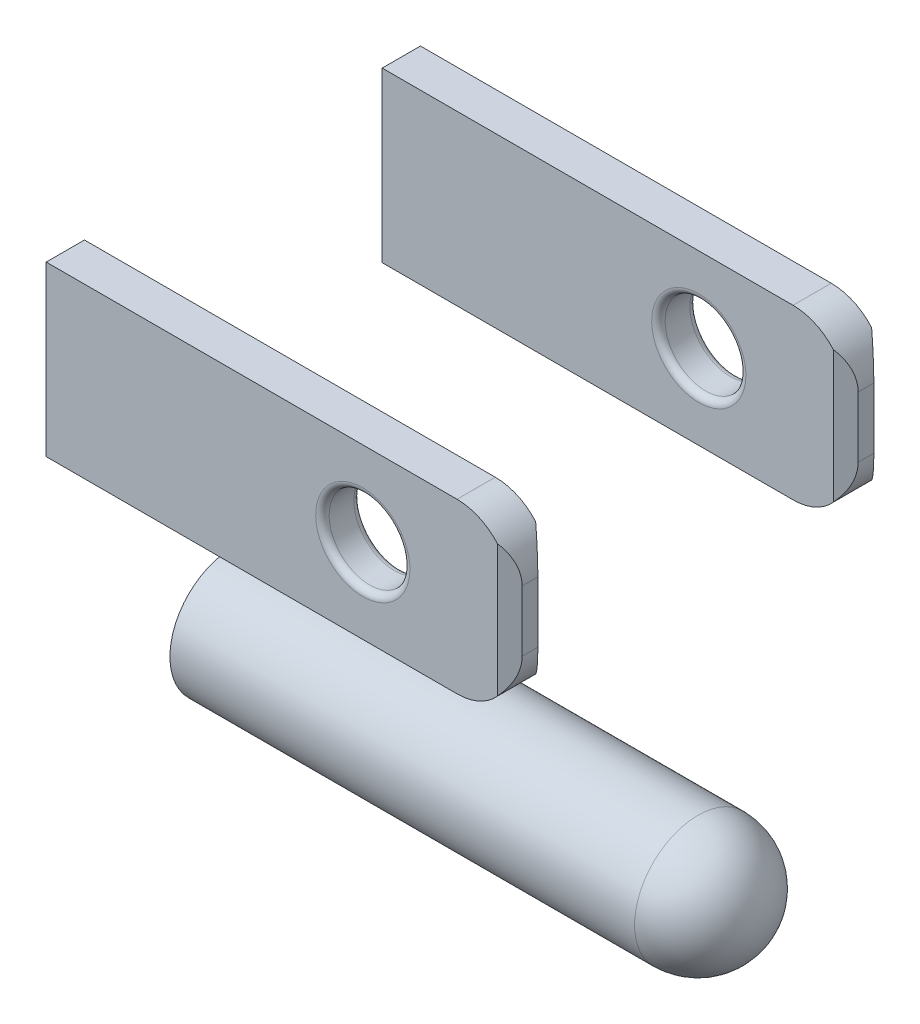
ISO-10303-21;
HEADER;
FILE_DESCRIPTION(('STEP AP214'),'2;1');
FILE_NAME('part.step','',(''),(''),'','','');
FILE_SCHEMA(('AUTOMOTIVE_DESIGN { 1 0 10303 214 1 1 1 1 }'));
ENDSEC;
DATA;
#1=APPLICATION_CONTEXT('core data for automotive mechanical design processes');
#2=APPLICATION_PROTOCOL_DEFINITION('international standard','automotive_design',2000,#1);
#3=PRODUCT_CONTEXT('',#1,'mechanical');
#4=PRODUCT('Part','Part','',(#3));
#5=PRODUCT_RELATED_PRODUCT_CATEGORY('part','',(#4));
#6=PRODUCT_DEFINITION_FORMATION('','',#4);
#7=PRODUCT_DEFINITION_CONTEXT('part definition',#1,'design');
#8=PRODUCT_DEFINITION('design','',#6,#7);
#9=PRODUCT_DEFINITION_SHAPE('','',#8);
#10=(LENGTH_UNIT() NAMED_UNIT(*) SI_UNIT(.MILLI.,.METRE.));
#11=(NAMED_UNIT(*) PLANE_ANGLE_UNIT() SI_UNIT($,.RADIAN.));
#12=(NAMED_UNIT(*) SI_UNIT($,.STERADIAN.) SOLID_ANGLE_UNIT());
#13=UNCERTAINTY_MEASURE_WITH_UNIT(LENGTH_MEASURE(1.E-05),#10,'distance_accuracy_value','');
#14=(GEOMETRIC_REPRESENTATION_CONTEXT(3) GLOBAL_UNCERTAINTY_ASSIGNED_CONTEXT((#13)) GLOBAL_UNIT_ASSIGNED_CONTEXT((#10,
#11,#12)) REPRESENTATION_CONTEXT('',''));
#15=CARTESIAN_POINT('',(0.,0.,0.));
#16=DIRECTION('',(0.,0.,1.));
#17=DIRECTION('',(1.,0.,0.));
#18=AXIS2_PLACEMENT_3D('',#15,#16,#17);
#19=CARTESIAN_POINT('',(17.26,-8.05999999999999,0.));
#20=DIRECTION('',(-1.,0.,0.));
#21=DIRECTION('',(0.,0.,1.));
#22=AXIS2_PLACEMENT_3D('',#19,#20,#21);
#23=CYLINDRICAL_SURFACE('',#22,2.355);
#24=CARTESIAN_POINT('',(17.26,-8.05999999999999,0.));
#25=DIRECTION('',(1.,0.,0.));
#26=DIRECTION('',(0.,0.,-1.));
#27=AXIS2_PLACEMENT_3D('',#24,#25,#26);
#28=CIRCLE('',#27,2.355);
#29=CARTESIAN_POINT('',(17.26,-8.05999999999999,-2.355));
#30=VERTEX_POINT('',#29);
#31=EDGE_CURVE('E11',#30,#30,#28,.T.);
#32=ORIENTED_EDGE('',*,*,#31,.F.);
#33=EDGE_LOOP('',(#32));
#34=FACE_BOUND('',#33,.T.);
#35=CARTESIAN_POINT('',(0.,-8.05999999999999,0.));
#36=DIRECTION('',(1.,0.,0.));
#37=DIRECTION('',(0.,0.,-1.));
#38=AXIS2_PLACEMENT_3D('',#35,#36,#37);
#39=CIRCLE('',#38,2.355);
#40=CARTESIAN_POINT('',(0.,-8.05999999999999,-2.355));
#41=VERTEX_POINT('',#40);
#42=EDGE_CURVE('E48',#41,#41,#39,.T.);
#43=ORIENTED_EDGE('',*,*,#42,.T.);
#44=EDGE_LOOP('',(#43));
#45=FACE_BOUND('',#44,.T.);
#46=ADVANCED_FACE('F41',(#34,#45),#23,.T.);
#47=CARTESIAN_POINT('',(17.2549946808511,-8.05999999999999,0.));
#48=DIRECTION('',(0.,0.,1.));
#49=DIRECTION('',(1.,0.,0.));
#50=AXIS2_PLACEMENT_3D('',#47,#48,#49);
#51=SPHERICAL_SURFACE('',#50,2.35500531914894);
#52=CARTESIAN_POINT('',(17.2549946808511,-8.05999999999999,0.));
#53=DIRECTION('',(1.,0.,0.));
#54=DIRECTION('',(0.,0.,-1.));
#55=AXIS2_PLACEMENT_3D('',#52,#53,#54);
#56=SPHERICAL_SURFACE('',#55,2.35500531914894);
#57=ORIENTED_EDGE('',*,*,#31,.T.);
#58=EDGE_LOOP('',(#57));
#59=FACE_BOUND('',#58,.T.);
#60=ADVANCED_FACE('F43',(#59),#56,.T.);
#61=CARTESIAN_POINT('',(0.,-8.05999999999999,0.));
#62=DIRECTION('',(1.,0.,0.));
#63=DIRECTION('',(0.,0.,-1.));
#64=AXIS2_PLACEMENT_3D('',#61,#62,#63);
#65=PLANE('',#64);
#66=ORIENTED_EDGE('',*,*,#42,.F.);
#67=EDGE_LOOP('',(#66));
#68=FACE_BOUND('',#67,.T.);
#69=ADVANCED_FACE('F55',(#68),#65,.F.);
#70=CLOSED_SHELL('',(#46,#60,#69));
#71=MANIFOLD_SOLID_BREP('B2',#70);
#72=CARTESIAN_POINT('',(17.26,0.675000000000007,5.53));
#73=DIRECTION('',(0.,0.,1.));
#74=DIRECTION('',(0.,-1.,0.));
#75=AXIS2_PLACEMENT_3D('',#72,#73,#74);
#76=PLANE('',#75);
#77=CARTESIAN_POINT('',(11.76,3.80500000000001,5.53));
#78=DIRECTION('',(0.,0.,1.));
#79=DIRECTION('',(0.,-1.,0.));
#80=AXIS2_PLACEMENT_3D('',#77,#78,#79);
#81=CIRCLE('',#80,1.75);
#82=CARTESIAN_POINT('',(11.76,2.05500000000001,5.53));
#83=VERTEX_POINT('',#82);
#84=EDGE_CURVE('E39',#83,#83,#81,.T.);
#85=ORIENTED_EDGE('',*,*,#84,.T.);
#86=EDGE_LOOP('',(#85));
#87=FACE_BOUND('',#86,.T.);
#88=DIRECTION('',(-1.,0.,0.));
#89=VECTOR('',#88,1.);
#90=CARTESIAN_POINT('',(17.26,6.93500000000001,5.53));
#91=LINE('',#90,#89);
#92=CARTESIAN_POINT('',(15.26,6.93500000000001,5.53));
#93=VERTEX_POINT('',#92);
#94=CARTESIAN_POINT('',(0.,6.93500000000001,5.53));
#95=VERTEX_POINT('',#94);
#96=EDGE_CURVE('E156',#93,#95,#91,.T.);
#97=ORIENTED_EDGE('',*,*,#96,.F.);
#98=CARTESIAN_POINT('',(15.26,4.93500000000001,5.53));
#99=DIRECTION('',(0.,0.,1.));
#100=DIRECTION('',(0.,-1.,0.));
#101=AXIS2_PLACEMENT_3D('',#98,#99,#100);
#102=CIRCLE('',#101,2.);
#103=CARTESIAN_POINT('',(16.76,6.2578756555323,5.53));
#104=VERTEX_POINT('',#103);
#105=EDGE_CURVE('E214',#93,#104,#102,.F.);
#106=ORIENTED_EDGE('',*,*,#105,.T.);
#107=DIRECTION('',(0.,-1.,0.));
#108=VECTOR('',#107,1.);
#109=CARTESIAN_POINT('',(16.76,0.675000000000007,5.53));
#110=LINE('',#109,#108);
#111=CARTESIAN_POINT('',(16.76,1.35212434446771,5.53));
#112=VERTEX_POINT('',#111);
#113=EDGE_CURVE('E196',#104,#112,#110,.T.);
#114=ORIENTED_EDGE('',*,*,#113,.T.);
#115=CARTESIAN_POINT('',(15.26,2.67500000000001,5.53));
#116=DIRECTION('',(0.,0.,1.));
#117=DIRECTION('',(0.,-1.,0.));
#118=AXIS2_PLACEMENT_3D('',#115,#116,#117);
#119=CIRCLE('',#118,2.);
#120=CARTESIAN_POINT('',(15.26,0.675000000000007,5.53));
#121=VERTEX_POINT('',#120);
#122=EDGE_CURVE('E105',#112,#121,#119,.F.);
#123=ORIENTED_EDGE('',*,*,#122,.T.);
#124=DIRECTION('',(-1.,0.,0.));
#125=VECTOR('',#124,1.);
#126=CARTESIAN_POINT('',(17.26,0.675000000000007,5.53));
#127=LINE('',#126,#125);
#128=CARTESIAN_POINT('',(0.,0.675000000000007,5.53));
#129=VERTEX_POINT('',#128);
#130=EDGE_CURVE('E177',#121,#129,#127,.T.);
#131=ORIENTED_EDGE('',*,*,#130,.T.);
#132=DIRECTION('',(0.,1.,0.));
#133=VECTOR('',#132,1.);
#134=CARTESIAN_POINT('',(0.,0.675000000000007,5.53));
#135=LINE('',#134,#133);
#136=EDGE_CURVE('E173',#129,#95,#135,.T.);
#137=ORIENTED_EDGE('',*,*,#136,.T.);
#138=EDGE_LOOP('',(#97,#106,#114,#123,#131,#137));
#139=FACE_BOUND('',#138,.T.);
#140=ADVANCED_FACE('F90',(#87,#139),#76,.F.);
#141=CARTESIAN_POINT('',(17.26,6.93500000000001,5.53));
#142=DIRECTION('',(0.,-1.,0.));
#143=DIRECTION('',(0.,0.,-1.));
#144=AXIS2_PLACEMENT_3D('',#141,#142,#143);
#145=PLANE('',#144);
#146=DIRECTION('',(-1.,0.,0.));
#147=VECTOR('',#146,1.);
#148=CARTESIAN_POINT('',(17.26,6.93500000000001,6.95));
#149=LINE('',#148,#147);
#150=CARTESIAN_POINT('',(15.26,6.93500000000001,6.95));
#151=VERTEX_POINT('',#150);
#152=CARTESIAN_POINT('',(0.,6.93500000000001,6.95));
#153=VERTEX_POINT('',#152);
#154=EDGE_CURVE('E167',#151,#153,#149,.T.);
#155=ORIENTED_EDGE('',*,*,#154,.F.);
#156=DIRECTION('',(0.,0.,1.));
#157=VECTOR('',#156,1.);
#158=CARTESIAN_POINT('',(15.26,6.93500000000001,5.94954981558864));
#159=LINE('',#158,#157);
#160=EDGE_CURVE('E163',#151,#93,#159,.F.);
#161=ORIENTED_EDGE('',*,*,#160,.T.);
#162=ORIENTED_EDGE('',*,*,#96,.T.);
#163=DIRECTION('',(0.,0.,1.));
#164=VECTOR('',#163,1.);
#165=CARTESIAN_POINT('',(0.,6.93500000000001,5.53));
#166=LINE('',#165,#164);
#167=EDGE_CURVE('E160',#95,#153,#166,.T.);
#168=ORIENTED_EDGE('',*,*,#167,.T.);
#169=EDGE_LOOP('',(#155,#161,#162,#168));
#170=FACE_BOUND('',#169,.T.);
#171=ADVANCED_FACE('F159',(#170),#145,.F.);
#172=CARTESIAN_POINT('',(17.26,6.93500000000001,6.95));
#173=DIRECTION('',(0.,0.,-1.));
#174=DIRECTION('',(0.,1.,0.));
#175=AXIS2_PLACEMENT_3D('',#172,#173,#174);
#176=PLANE('',#175);
#177=CARTESIAN_POINT('',(11.76,3.80500000000001,6.95));
#178=DIRECTION('',(0.,0.,-1.));
#179=DIRECTION('',(0.,1.,0.));
#180=AXIS2_PLACEMENT_3D('',#177,#178,#179);
#181=CIRCLE('',#180,1.75);
#182=CARTESIAN_POINT('',(11.76,5.55500000000001,6.95));
#183=VERTEX_POINT('',#182);
#184=EDGE_CURVE('E98',#183,#183,#181,.T.);
#185=ORIENTED_EDGE('',*,*,#184,.T.);
#186=EDGE_LOOP('',(#185));
#187=FACE_BOUND('',#186,.T.);
#188=DIRECTION('',(0.,1.,0.));
#189=VECTOR('',#188,1.);
#190=CARTESIAN_POINT('',(16.76,6.93500000000001,6.95));
#191=LINE('',#190,#189);
#192=CARTESIAN_POINT('',(16.76,1.35212434446771,6.95));
#193=VERTEX_POINT('',#192);
#194=CARTESIAN_POINT('',(16.76,6.2578756555323,6.95));
#195=VERTEX_POINT('',#194);
#196=EDGE_CURVE('E193',#193,#195,#191,.T.);
#197=ORIENTED_EDGE('',*,*,#196,.T.);
#198=CARTESIAN_POINT('',(15.26,4.93500000000001,6.95));
#199=DIRECTION('',(0.,0.,-1.));
#200=DIRECTION('',(0.,1.,0.));
#201=AXIS2_PLACEMENT_3D('',#198,#199,#200);
#202=CIRCLE('',#201,2.);
#203=EDGE_CURVE('E210',#195,#151,#202,.F.);
#204=ORIENTED_EDGE('',*,*,#203,.T.);
#205=ORIENTED_EDGE('',*,*,#154,.T.);
#206=DIRECTION('',(0.,-1.,0.));
#207=VECTOR('',#206,1.);
#208=CARTESIAN_POINT('',(0.,6.93500000000001,6.95));
#209=LINE('',#208,#207);
#210=CARTESIAN_POINT('',(0.,0.675000000000007,6.95));
#211=VERTEX_POINT('',#210);
#212=EDGE_CURVE('E175',#153,#211,#209,.T.);
#213=ORIENTED_EDGE('',*,*,#212,.T.);
#214=DIRECTION('',(-1.,0.,0.));
#215=VECTOR('',#214,1.);
#216=CARTESIAN_POINT('',(17.26,0.675000000000007,6.95));
#217=LINE('',#216,#215);
#218=CARTESIAN_POINT('',(15.26,0.675000000000007,6.95));
#219=VERTEX_POINT('',#218);
#220=EDGE_CURVE('E185',#219,#211,#217,.T.);
#221=ORIENTED_EDGE('',*,*,#220,.F.);
#222=CARTESIAN_POINT('',(15.26,2.67500000000001,6.95));
#223=DIRECTION('',(0.,0.,-1.));
#224=DIRECTION('',(0.,1.,0.));
#225=AXIS2_PLACEMENT_3D('',#222,#223,#224);
#226=CIRCLE('',#225,2.);
#227=EDGE_CURVE('E208',#219,#193,#226,.F.);
#228=ORIENTED_EDGE('',*,*,#227,.T.);
#229=EDGE_LOOP('',(#197,#204,#205,#213,#221,#228));
#230=FACE_BOUND('',#229,.T.);
#231=ADVANCED_FACE('F229',(#187,#230),#176,.F.);
#232=CARTESIAN_POINT('',(17.26,0.675000000000007,6.95));
#233=DIRECTION('',(0.,1.,0.));
#234=DIRECTION('',(0.,0.,1.));
#235=AXIS2_PLACEMENT_3D('',#232,#233,#234);
#236=PLANE('',#235);
#237=ORIENTED_EDGE('',*,*,#130,.F.);
#238=DIRECTION('',(0.,0.,-1.));
#239=VECTOR('',#238,1.);
#240=CARTESIAN_POINT('',(15.26,0.675000000000007,6.53045018441136));
#241=LINE('',#240,#239);
#242=EDGE_CURVE('E219',#121,#219,#241,.F.);
#243=ORIENTED_EDGE('',*,*,#242,.T.);
#244=ORIENTED_EDGE('',*,*,#220,.T.);
#245=DIRECTION('',(0.,0.,-1.));
#246=VECTOR('',#245,1.);
#247=CARTESIAN_POINT('',(0.,0.675000000000007,6.95));
#248=LINE('',#247,#246);
#249=EDGE_CURVE('E182',#211,#129,#248,.T.);
#250=ORIENTED_EDGE('',*,*,#249,.T.);
#251=EDGE_LOOP('',(#237,#243,#244,#250));
#252=FACE_BOUND('',#251,.T.);
#253=ADVANCED_FACE('F284',(#252),#236,.F.);
#254=CARTESIAN_POINT('',(17.26,0.,0.));
#255=DIRECTION('',(1.,0.,0.));
#256=DIRECTION('',(0.,0.,-1.));
#257=AXIS2_PLACEMENT_3D('',#254,#255,#256);
#258=PLANE('',#257);
#259=DIRECTION('',(0.,1.,0.));
#260=VECTOR('',#259,1.);
#261=CARTESIAN_POINT('',(17.26,6.93500000000001,5.94954981558864));
#262=LINE('',#261,#260);
#263=CARTESIAN_POINT('',(17.26,2.67500000000001,5.94954981558864));
#264=VERTEX_POINT('',#263);
#265=CARTESIAN_POINT('',(17.26,4.93500000000001,5.94954981558864));
#266=VERTEX_POINT('',#265);
#267=EDGE_CURVE('E166',#264,#266,#262,.T.);
#268=ORIENTED_EDGE('',*,*,#267,.T.);
#269=DIRECTION('',(0.,0.,1.));
#270=VECTOR('',#269,1.);
#271=CARTESIAN_POINT('',(17.26,4.93500000000001,6.53045018441136));
#272=LINE('',#271,#270);
#273=CARTESIAN_POINT('',(17.26,4.93500000000001,6.53045018441136));
#274=VERTEX_POINT('',#273);
#275=EDGE_CURVE('E201',#266,#274,#272,.T.);
#276=ORIENTED_EDGE('',*,*,#275,.T.);
#277=DIRECTION('',(0.,-1.,0.));
#278=VECTOR('',#277,1.);
#279=CARTESIAN_POINT('',(17.26,0.675000000000007,6.53045018441136));
#280=LINE('',#279,#278);
#281=CARTESIAN_POINT('',(17.26,2.67500000000001,6.53045018441136));
#282=VERTEX_POINT('',#281);
#283=EDGE_CURVE('E190',#274,#282,#280,.T.);
#284=ORIENTED_EDGE('',*,*,#283,.T.);
#285=DIRECTION('',(0.,0.,-1.));
#286=VECTOR('',#285,1.);
#287=CARTESIAN_POINT('',(17.26,2.67500000000001,5.94954981558864));
#288=LINE('',#287,#286);
#289=EDGE_CURVE('E198',#282,#264,#288,.T.);
#290=ORIENTED_EDGE('',*,*,#289,.T.);
#291=EDGE_LOOP('',(#268,#276,#284,#290));
#292=FACE_BOUND('',#291,.T.);
#293=ADVANCED_FACE('F282',(#292),#258,.T.);
#294=CARTESIAN_POINT('',(0.,0.,0.));
#295=DIRECTION('',(1.,0.,0.));
#296=DIRECTION('',(0.,0.,-1.));
#297=AXIS2_PLACEMENT_3D('',#294,#295,#296);
#298=PLANE('',#297);
#299=ORIENTED_EDGE('',*,*,#136,.F.);
#300=ORIENTED_EDGE('',*,*,#249,.F.);
#301=ORIENTED_EDGE('',*,*,#212,.F.);
#302=ORIENTED_EDGE('',*,*,#167,.F.);
#303=EDGE_LOOP('',(#299,#300,#301,#302));
#304=FACE_BOUND('',#303,.T.);
#305=ADVANCED_FACE('F171',(#304),#298,.F.);
#306=CARTESIAN_POINT('',(17.26,0.,6.53045018441136));
#307=DIRECTION('',(0.642787609686536,0.,0.766044443118981));
#308=DIRECTION('',(0.,1.,0.));
#309=AXIS2_PLACEMENT_3D('',#306,#307,#308);
#310=PLANE('',#309);
#311=ORIENTED_EDGE('',*,*,#283,.F.);
#312=CARTESIAN_POINT('',(15.26,4.93500000000001,8.20864944676591));
#313=DIRECTION('',(0.642787609686536,0.,0.766044443118981));
#314=DIRECTION('',(0.766044443118981,0.,-0.642787609686536));
#315=AXIS2_PLACEMENT_3D('',#312,#313,#314);
#316=ELLIPSE('',#315,2.61081457866455,2.);
#317=EDGE_CURVE('E206',#274,#195,#316,.T.);
#318=ORIENTED_EDGE('',*,*,#317,.T.);
#319=ORIENTED_EDGE('',*,*,#196,.F.);
#320=CARTESIAN_POINT('',(15.26,2.67500000000001,8.20864944676591));
#321=DIRECTION('',(0.642787609686536,0.,0.766044443118981));
#322=DIRECTION('',(-0.766044443118981,0.,0.642787609686536));
#323=AXIS2_PLACEMENT_3D('',#320,#321,#322);
#324=ELLIPSE('',#323,2.61081457866455,2.);
#325=EDGE_CURVE('E204',#193,#282,#324,.T.);
#326=ORIENTED_EDGE('',*,*,#325,.T.);
#327=EDGE_LOOP('',(#311,#318,#319,#326));
#328=FACE_BOUND('',#327,.T.);
#329=ADVANCED_FACE('F256',(#328),#310,.T.);
#330=CARTESIAN_POINT('',(17.26,0.,5.94954981558864));
#331=DIRECTION('',(0.642787609686536,0.,-0.766044443118981));
#332=DIRECTION('',(0.,-1.,0.));
#333=AXIS2_PLACEMENT_3D('',#330,#331,#332);
#334=PLANE('',#333);
#335=ORIENTED_EDGE('',*,*,#113,.F.);
#336=CARTESIAN_POINT('',(15.26,4.93500000000001,4.27135055323409));
#337=DIRECTION('',(0.642787609686536,0.,-0.766044443118981));
#338=DIRECTION('',(-0.766044443118981,0.,-0.642787609686536));
#339=AXIS2_PLACEMENT_3D('',#336,#337,#338);
#340=ELLIPSE('',#339,2.61081457866455,2.);
#341=EDGE_CURVE('E217',#104,#266,#340,.T.);
#342=ORIENTED_EDGE('',*,*,#341,.T.);
#343=ORIENTED_EDGE('',*,*,#267,.F.);
#344=CARTESIAN_POINT('',(15.26,2.67500000000001,4.27135055323409));
#345=DIRECTION('',(0.642787609686536,0.,-0.766044443118981));
#346=DIRECTION('',(0.766044443118981,0.,0.642787609686536));
#347=AXIS2_PLACEMENT_3D('',#344,#345,#346);
#348=ELLIPSE('',#347,2.61081457866455,2.);
#349=EDGE_CURVE('E113',#264,#112,#348,.T.);
#350=ORIENTED_EDGE('',*,*,#349,.T.);
#351=EDGE_LOOP('',(#335,#342,#343,#350));
#352=FACE_BOUND('',#351,.T.);
#353=ADVANCED_FACE('F259',(#352),#334,.T.);
#354=CARTESIAN_POINT('',(15.26,4.93500000000001,0.));
#355=DIRECTION('',(0.,0.,-1.));
#356=DIRECTION('',(-1.,0.,0.));
#357=AXIS2_PLACEMENT_3D('',#354,#355,#356);
#358=CYLINDRICAL_SURFACE('',#357,2.);
#359=ORIENTED_EDGE('',*,*,#105,.F.);
#360=ORIENTED_EDGE('',*,*,#160,.F.);
#361=ORIENTED_EDGE('',*,*,#203,.F.);
#362=ORIENTED_EDGE('',*,*,#317,.F.);
#363=ORIENTED_EDGE('',*,*,#275,.F.);
#364=ORIENTED_EDGE('',*,*,#341,.F.);
#365=EDGE_LOOP('',(#359,#360,#361,#362,#363,#364));
#366=FACE_BOUND('',#365,.T.);
#367=ADVANCED_FACE('F263',(#366),#358,.T.);
#368=CARTESIAN_POINT('',(15.26,2.67500000000001,0.));
#369=DIRECTION('',(0.,0.,1.));
#370=DIRECTION('',(1.,0.,0.));
#371=AXIS2_PLACEMENT_3D('',#368,#369,#370);
#372=CYLINDRICAL_SURFACE('',#371,2.);
#373=ORIENTED_EDGE('',*,*,#227,.F.);
#374=ORIENTED_EDGE('',*,*,#242,.F.);
#375=ORIENTED_EDGE('',*,*,#122,.F.);
#376=ORIENTED_EDGE('',*,*,#349,.F.);
#377=ORIENTED_EDGE('',*,*,#289,.F.);
#378=ORIENTED_EDGE('',*,*,#325,.F.);
#379=EDGE_LOOP('',(#373,#374,#375,#376,#377,#378));
#380=FACE_BOUND('',#379,.T.);
#381=ADVANCED_FACE('F240',(#380),#372,.T.);
#382=CARTESIAN_POINT('',(11.76,3.80500000000001,-14.05));
#383=DIRECTION('',(0.,0.,1.));
#384=DIRECTION('',(1.,0.,0.));
#385=AXIS2_PLACEMENT_3D('',#382,#383,#384);
#386=CYLINDRICAL_SURFACE('',#385,1.5);
#387=CARTESIAN_POINT('',(11.76,3.80500000000001,6.7));
#388=DIRECTION('',(0.,0.,-1.));
#389=DIRECTION('',(0.,1.,0.));
#390=AXIS2_PLACEMENT_3D('',#387,#388,#389);
#391=CIRCLE('',#390,1.5);
#392=CARTESIAN_POINT('',(11.76,5.30500000000001,6.7));
#393=VERTEX_POINT('',#392);
#394=EDGE_CURVE('E224',#393,#393,#391,.F.);
#395=ORIENTED_EDGE('',*,*,#394,.T.);
#396=EDGE_LOOP('',(#395));
#397=FACE_BOUND('',#396,.T.);
#398=CARTESIAN_POINT('',(11.76,3.80500000000001,5.78));
#399=DIRECTION('',(0.,0.,1.));
#400=DIRECTION('',(0.,-1.,0.));
#401=AXIS2_PLACEMENT_3D('',#398,#399,#400);
#402=CIRCLE('',#401,1.5);
#403=CARTESIAN_POINT('',(11.76,2.30500000000001,5.78));
#404=VERTEX_POINT('',#403);
#405=EDGE_CURVE('E221',#404,#404,#402,.F.);
#406=ORIENTED_EDGE('',*,*,#405,.T.);
#407=EDGE_LOOP('',(#406));
#408=FACE_BOUND('',#407,.T.);
#409=ADVANCED_FACE('F235',(#397,#408),#386,.F.);
#410=CARTESIAN_POINT('',(11.76,3.80500000000001,6.7));
#411=DIRECTION('',(0.,0.,-1.));
#412=DIRECTION('',(0.,1.,0.));
#413=AXIS2_PLACEMENT_3D('',#410,#411,#412);
#414=TOROIDAL_SURFACE('',#413,1.75,0.25);
#415=ORIENTED_EDGE('',*,*,#184,.F.);
#416=EDGE_LOOP('',(#415));
#417=FACE_BOUND('',#416,.T.);
#418=ORIENTED_EDGE('',*,*,#394,.F.);
#419=EDGE_LOOP('',(#418));
#420=FACE_BOUND('',#419,.T.);
#421=ADVANCED_FACE('F232',(#417,#420),#414,.T.);
#422=CARTESIAN_POINT('',(11.76,3.80500000000001,5.78));
#423=DIRECTION('',(0.,0.,1.));
#424=DIRECTION('',(0.,-1.,0.));
#425=AXIS2_PLACEMENT_3D('',#422,#423,#424);
#426=TOROIDAL_SURFACE('',#425,1.75,0.25);
#427=ORIENTED_EDGE('',*,*,#405,.F.);
#428=EDGE_LOOP('',(#427));
#429=FACE_BOUND('',#428,.T.);
#430=ORIENTED_EDGE('',*,*,#84,.F.);
#431=EDGE_LOOP('',(#430));
#432=FACE_BOUND('',#431,.T.);
#433=ADVANCED_FACE('F92',(#429,#432),#426,.T.);
#434=CLOSED_SHELL('',(#140,#171,#231,#253,#293,#305,#329,#353,#367,#381,#409,#421,#433));
#435=MANIFOLD_SOLID_BREP('B6',#434);
#436=CARTESIAN_POINT('',(17.26,0.675000000000008,-6.95));
#437=DIRECTION('',(0.,0.,1.));
#438=DIRECTION('',(0.,-1.,0.));
#439=AXIS2_PLACEMENT_3D('',#436,#437,#438);
#440=PLANE('',#439);
#441=CARTESIAN_POINT('',(11.76,3.80500000000001,-6.95));
#442=DIRECTION('',(0.,0.,1.));
#443=DIRECTION('',(0.,-1.,0.));
#444=AXIS2_PLACEMENT_3D('',#441,#442,#443);
#445=CIRCLE('',#444,1.75);
#446=CARTESIAN_POINT('',(11.76,2.05500000000001,-6.95));
#447=VERTEX_POINT('',#446);
#448=EDGE_CURVE('E88',#447,#447,#445,.T.);
#449=ORIENTED_EDGE('',*,*,#448,.T.);
#450=EDGE_LOOP('',(#449));
#451=FACE_BOUND('',#450,.T.);
#452=DIRECTION('',(0.,-1.,0.));
#453=VECTOR('',#452,1.);
#454=CARTESIAN_POINT('',(16.76,0.675000000000008,-6.95));
#455=LINE('',#454,#453);
#456=CARTESIAN_POINT('',(16.76,6.2578756555323,-6.95));
#457=VERTEX_POINT('',#456);
#458=CARTESIAN_POINT('',(16.76,1.35212434446771,-6.95));
#459=VERTEX_POINT('',#458);
#460=EDGE_CURVE('E473',#457,#459,#455,.T.);
#461=ORIENTED_EDGE('',*,*,#460,.T.);
#462=CARTESIAN_POINT('',(15.26,2.67500000000001,-6.95));
#463=DIRECTION('',(0.,0.,1.));
#464=DIRECTION('',(0.,-1.,0.));
#465=AXIS2_PLACEMENT_3D('',#462,#463,#464);
#466=CIRCLE('',#465,2.);
#467=CARTESIAN_POINT('',(15.26,0.675000000000008,-6.95));
#468=VERTEX_POINT('',#467);
#469=EDGE_CURVE('E489',#459,#468,#466,.F.);
#470=ORIENTED_EDGE('',*,*,#469,.T.);
#471=DIRECTION('',(-1.,0.,0.));
#472=VECTOR('',#471,1.);
#473=CARTESIAN_POINT('',(17.26,0.675000000000008,-6.95));
#474=LINE('',#473,#472);
#475=CARTESIAN_POINT('',(0.,0.675000000000008,-6.95));
#476=VERTEX_POINT('',#475);
#477=EDGE_CURVE('E457',#468,#476,#474,.T.);
#478=ORIENTED_EDGE('',*,*,#477,.T.);
#479=DIRECTION('',(0.,1.,0.));
#480=VECTOR('',#479,1.);
#481=CARTESIAN_POINT('',(0.,0.675000000000008,-6.95));
#482=LINE('',#481,#480);
#483=CARTESIAN_POINT('',(0.,6.93500000000001,-6.95));
#484=VERTEX_POINT('',#483);
#485=EDGE_CURVE('E451',#476,#484,#482,.T.);
#486=ORIENTED_EDGE('',*,*,#485,.T.);
#487=DIRECTION('',(-1.,0.,0.));
#488=VECTOR('',#487,1.);
#489=CARTESIAN_POINT('',(17.26,6.93500000000001,-6.95));
#490=LINE('',#489,#488);
#491=CARTESIAN_POINT('',(15.26,6.93500000000001,-6.95));
#492=VERTEX_POINT('',#491);
#493=EDGE_CURVE('E434',#492,#484,#490,.T.);
#494=ORIENTED_EDGE('',*,*,#493,.F.);
#495=CARTESIAN_POINT('',(15.26,4.93500000000001,-6.95));
#496=DIRECTION('',(0.,0.,1.));
#497=DIRECTION('',(0.,-1.,0.));
#498=AXIS2_PLACEMENT_3D('',#495,#496,#497);
#499=CIRCLE('',#498,2.);
#500=EDGE_CURVE('E487',#492,#457,#499,.F.);
#501=ORIENTED_EDGE('',*,*,#500,.T.);
#502=EDGE_LOOP('',(#461,#470,#478,#486,#494,#501));
#503=FACE_BOUND('',#502,.T.);
#504=ADVANCED_FACE('F368',(#451,#503),#440,.F.);
#505=CARTESIAN_POINT('',(17.26,6.93500000000001,-6.95));
#506=DIRECTION('',(0.,-1.,0.));
#507=DIRECTION('',(0.,0.,-1.));
#508=AXIS2_PLACEMENT_3D('',#505,#506,#507);
#509=PLANE('',#508);
#510=DIRECTION('',(-1.,0.,0.));
#511=VECTOR('',#510,1.);
#512=CARTESIAN_POINT('',(17.26,6.93500000000001,-5.53));
#513=LINE('',#512,#511);
#514=CARTESIAN_POINT('',(15.26,6.93500000000001,-5.53));
#515=VERTEX_POINT('',#514);
#516=CARTESIAN_POINT('',(0.,6.93500000000001,-5.53));
#517=VERTEX_POINT('',#516);
#518=EDGE_CURVE('E445',#515,#517,#513,.T.);
#519=ORIENTED_EDGE('',*,*,#518,.F.);
#520=DIRECTION('',(0.,0.,1.));
#521=VECTOR('',#520,1.);
#522=CARTESIAN_POINT('',(15.26,6.93500000000001,-6.53045018441136));
#523=LINE('',#522,#521);
#524=EDGE_CURVE('E440',#515,#492,#523,.F.);
#525=ORIENTED_EDGE('',*,*,#524,.T.);
#526=ORIENTED_EDGE('',*,*,#493,.T.);
#527=DIRECTION('',(0.,0.,1.));
#528=VECTOR('',#527,1.);
#529=CARTESIAN_POINT('',(0.,6.93500000000001,-6.95));
#530=LINE('',#529,#528);
#531=EDGE_CURVE('E437',#484,#517,#530,.T.);
#532=ORIENTED_EDGE('',*,*,#531,.T.);
#533=EDGE_LOOP('',(#519,#525,#526,#532));
#534=FACE_BOUND('',#533,.T.);
#535=ADVANCED_FACE('F436',(#534),#509,.F.);
#536=CARTESIAN_POINT('',(17.26,6.93500000000001,-5.53));
#537=DIRECTION('',(0.,0.,-1.));
#538=DIRECTION('',(0.,1.,0.));
#539=AXIS2_PLACEMENT_3D('',#536,#537,#538);
#540=PLANE('',#539);
#541=CARTESIAN_POINT('',(11.76,3.80500000000001,-5.53));
#542=DIRECTION('',(0.,0.,-1.));
#543=DIRECTION('',(0.,1.,0.));
#544=AXIS2_PLACEMENT_3D('',#541,#542,#543);
#545=CIRCLE('',#544,1.75);
#546=CARTESIAN_POINT('',(11.76,5.55500000000001,-5.53));
#547=VERTEX_POINT('',#546);
#548=EDGE_CURVE('E500',#547,#547,#545,.T.);
#549=ORIENTED_EDGE('',*,*,#548,.T.);
#550=EDGE_LOOP('',(#549));
#551=FACE_BOUND('',#550,.T.);
#552=DIRECTION('',(-1.,0.,0.));
#553=VECTOR('',#552,1.);
#554=CARTESIAN_POINT('',(17.26,0.675000000000007,-5.53));
#555=LINE('',#554,#553);
#556=CARTESIAN_POINT('',(15.26,0.675000000000007,-5.53));
#557=VERTEX_POINT('',#556);
#558=CARTESIAN_POINT('',(0.,0.675000000000007,-5.53));
#559=VERTEX_POINT('',#558);
#560=EDGE_CURVE('E465',#557,#559,#555,.T.);
#561=ORIENTED_EDGE('',*,*,#560,.F.);
#562=CARTESIAN_POINT('',(15.26,2.67500000000001,-5.53));
#563=DIRECTION('',(0.,0.,-1.));
#564=DIRECTION('',(0.,1.,0.));
#565=AXIS2_PLACEMENT_3D('',#562,#563,#564);
#566=CIRCLE('',#565,2.);
#567=CARTESIAN_POINT('',(16.76,1.35212434446771,-5.53));
#568=VERTEX_POINT('',#567);
#569=EDGE_CURVE('E494',#557,#568,#566,.F.);
#570=ORIENTED_EDGE('',*,*,#569,.T.);
#571=DIRECTION('',(0.,1.,0.));
#572=VECTOR('',#571,1.);
#573=CARTESIAN_POINT('',(16.76,6.93500000000001,-5.53));
#574=LINE('',#573,#572);
#575=CARTESIAN_POINT('',(16.76,6.2578756555323,-5.53));
#576=VERTEX_POINT('',#575);
#577=EDGE_CURVE('E475',#568,#576,#574,.T.);
#578=ORIENTED_EDGE('',*,*,#577,.T.);
#579=CARTESIAN_POINT('',(15.26,4.93500000000001,-5.53));
#580=DIRECTION('',(0.,0.,-1.));
#581=DIRECTION('',(0.,1.,0.));
#582=AXIS2_PLACEMENT_3D('',#579,#580,#581);
#583=CIRCLE('',#582,2.);
#584=EDGE_CURVE('E383',#576,#515,#583,.F.);
#585=ORIENTED_EDGE('',*,*,#584,.T.);
#586=ORIENTED_EDGE('',*,*,#518,.T.);
#587=DIRECTION('',(0.,-1.,0.));
#588=VECTOR('',#587,1.);
#589=CARTESIAN_POINT('',(0.,6.93500000000001,-5.53));
#590=LINE('',#589,#588);
#591=EDGE_CURVE('E453',#517,#559,#590,.T.);
#592=ORIENTED_EDGE('',*,*,#591,.T.);
#593=EDGE_LOOP('',(#561,#570,#578,#585,#586,#592));
#594=FACE_BOUND('',#593,.T.);
#595=ADVANCED_FACE('F516',(#551,#594),#540,.F.);
#596=CARTESIAN_POINT('',(17.26,0.675000000000007,-5.53));
#597=DIRECTION('',(0.,1.,0.));
#598=DIRECTION('',(0.,0.,1.));
#599=AXIS2_PLACEMENT_3D('',#596,#597,#598);
#600=PLANE('',#599);
#601=ORIENTED_EDGE('',*,*,#477,.F.);
#602=DIRECTION('',(0.,0.,-1.));
#603=VECTOR('',#602,1.);
#604=CARTESIAN_POINT('',(15.26,0.675000000000007,-5.94954981558864));
#605=LINE('',#604,#603);
#606=EDGE_CURVE('E491',#468,#557,#605,.F.);
#607=ORIENTED_EDGE('',*,*,#606,.T.);
#608=ORIENTED_EDGE('',*,*,#560,.T.);
#609=DIRECTION('',(0.,0.,-1.));
#610=VECTOR('',#609,1.);
#611=CARTESIAN_POINT('',(0.,0.675000000000007,-5.53));
#612=LINE('',#611,#610);
#613=EDGE_CURVE('E462',#559,#476,#612,.T.);
#614=ORIENTED_EDGE('',*,*,#613,.T.);
#615=EDGE_LOOP('',(#601,#607,#608,#614));
#616=FACE_BOUND('',#615,.T.);
#617=ADVANCED_FACE('F518',(#616),#600,.F.);
#618=CARTESIAN_POINT('',(17.26,0.,0.));
#619=DIRECTION('',(1.,0.,0.));
#620=DIRECTION('',(0.,0.,-1.));
#621=AXIS2_PLACEMENT_3D('',#618,#619,#620);
#622=PLANE('',#621);
#623=DIRECTION('',(0.,-1.,0.));
#624=VECTOR('',#623,1.);
#625=CARTESIAN_POINT('',(17.26,0.675000000000007,-5.94954981558864));
#626=LINE('',#625,#624);
#627=CARTESIAN_POINT('',(17.26,4.93500000000001,-5.94954981558864));
#628=VERTEX_POINT('',#627);
#629=CARTESIAN_POINT('',(17.26,2.67500000000001,-5.94954981558864));
#630=VERTEX_POINT('',#629);
#631=EDGE_CURVE('E444',#628,#630,#626,.T.);
#632=ORIENTED_EDGE('',*,*,#631,.T.);
#633=DIRECTION('',(0.,0.,-1.));
#634=VECTOR('',#633,1.);
#635=CARTESIAN_POINT('',(17.26,2.67500000000001,-6.53045018441136));
#636=LINE('',#635,#634);
#637=CARTESIAN_POINT('',(17.26,2.67500000000001,-6.53045018441136));
#638=VERTEX_POINT('',#637);
#639=EDGE_CURVE('E480',#630,#638,#636,.T.);
#640=ORIENTED_EDGE('',*,*,#639,.T.);
#641=DIRECTION('',(0.,1.,0.));
#642=VECTOR('',#641,1.);
#643=CARTESIAN_POINT('',(17.26,6.93500000000001,-6.53045018441136));
#644=LINE('',#643,#642);
#645=CARTESIAN_POINT('',(17.26,4.93500000000001,-6.53045018441136));
#646=VERTEX_POINT('',#645);
#647=EDGE_CURVE('E470',#638,#646,#644,.T.);
#648=ORIENTED_EDGE('',*,*,#647,.T.);
#649=DIRECTION('',(0.,0.,1.));
#650=VECTOR('',#649,1.);
#651=CARTESIAN_POINT('',(17.26,4.93500000000001,-5.94954981558864));
#652=LINE('',#651,#650);
#653=EDGE_CURVE('E477',#646,#628,#652,.T.);
#654=ORIENTED_EDGE('',*,*,#653,.T.);
#655=EDGE_LOOP('',(#632,#640,#648,#654));
#656=FACE_BOUND('',#655,.T.);
#657=ADVANCED_FACE('F531',(#656),#622,.T.);
#658=CARTESIAN_POINT('',(0.,0.,0.));
#659=DIRECTION('',(1.,0.,0.));
#660=DIRECTION('',(0.,0.,-1.));
#661=AXIS2_PLACEMENT_3D('',#658,#659,#660);
#662=PLANE('',#661);
#663=ORIENTED_EDGE('',*,*,#485,.F.);
#664=ORIENTED_EDGE('',*,*,#613,.F.);
#665=ORIENTED_EDGE('',*,*,#591,.F.);
#666=ORIENTED_EDGE('',*,*,#531,.F.);
#667=EDGE_LOOP('',(#663,#664,#665,#666));
#668=FACE_BOUND('',#667,.T.);
#669=ADVANCED_FACE('F449',(#668),#662,.F.);
#670=CARTESIAN_POINT('',(17.26,0.,-6.53045018441136));
#671=DIRECTION('',(0.642787609686536,0.,-0.766044443118981));
#672=DIRECTION('',(0.,-1.,0.));
#673=AXIS2_PLACEMENT_3D('',#670,#671,#672);
#674=PLANE('',#673);
#675=ORIENTED_EDGE('',*,*,#647,.F.);
#676=CARTESIAN_POINT('',(15.26,2.67500000000001,-8.20864944676591));
#677=DIRECTION('',(0.642787609686536,0.,-0.766044443118981));
#678=DIRECTION('',(0.766044443118981,0.,0.642787609686536));
#679=AXIS2_PLACEMENT_3D('',#676,#677,#678);
#680=ELLIPSE('',#679,2.61081457866455,2.);
#681=EDGE_CURVE('E485',#638,#459,#680,.T.);
#682=ORIENTED_EDGE('',*,*,#681,.T.);
#683=ORIENTED_EDGE('',*,*,#460,.F.);
#684=CARTESIAN_POINT('',(15.26,4.935,-8.20864944676591));
#685=DIRECTION('',(0.642787609686536,0.,-0.766044443118981));
#686=DIRECTION('',(-0.766044443118981,0.,-0.642787609686536));
#687=AXIS2_PLACEMENT_3D('',#684,#685,#686);
#688=ELLIPSE('',#687,2.61081457866455,2.);
#689=EDGE_CURVE('E483',#457,#646,#688,.T.);
#690=ORIENTED_EDGE('',*,*,#689,.T.);
#691=EDGE_LOOP('',(#675,#682,#683,#690));
#692=FACE_BOUND('',#691,.T.);
#693=ADVANCED_FACE('F539',(#692),#674,.T.);
#694=CARTESIAN_POINT('',(17.26,0.,-5.94954981558864));
#695=DIRECTION('',(0.642787609686536,0.,0.766044443118981));
#696=DIRECTION('',(0.,1.,0.));
#697=AXIS2_PLACEMENT_3D('',#694,#695,#696);
#698=PLANE('',#697);
#699=ORIENTED_EDGE('',*,*,#577,.F.);
#700=CARTESIAN_POINT('',(15.26,2.67500000000001,-4.27135055323409));
#701=DIRECTION('',(0.642787609686536,0.,0.766044443118981));
#702=DIRECTION('',(-0.766044443118981,0.,0.642787609686536));
#703=AXIS2_PLACEMENT_3D('',#700,#701,#702);
#704=ELLIPSE('',#703,2.61081457866455,2.);
#705=EDGE_CURVE('E497',#568,#630,#704,.T.);
#706=ORIENTED_EDGE('',*,*,#705,.T.);
#707=ORIENTED_EDGE('',*,*,#631,.F.);
#708=CARTESIAN_POINT('',(15.26,4.93500000000001,-4.27135055323409));
#709=DIRECTION('',(0.642787609686536,0.,0.766044443118981));
#710=DIRECTION('',(0.766044443118981,0.,-0.642787609686536));
#711=AXIS2_PLACEMENT_3D('',#708,#709,#710);
#712=ELLIPSE('',#711,2.61081457866455,2.);
#713=EDGE_CURVE('E391',#628,#576,#712,.T.);
#714=ORIENTED_EDGE('',*,*,#713,.T.);
#715=EDGE_LOOP('',(#699,#706,#707,#714));
#716=FACE_BOUND('',#715,.T.);
#717=ADVANCED_FACE('F529',(#716),#698,.T.);
#718=CARTESIAN_POINT('',(15.26,2.675,0.));
#719=DIRECTION('',(0.,0.,1.));
#720=DIRECTION('',(0.,-1.,0.));
#721=AXIS2_PLACEMENT_3D('',#718,#719,#720);
#722=CYLINDRICAL_SURFACE('',#721,2.);
#723=ORIENTED_EDGE('',*,*,#569,.F.);
#724=ORIENTED_EDGE('',*,*,#606,.F.);
#725=ORIENTED_EDGE('',*,*,#469,.F.);
#726=ORIENTED_EDGE('',*,*,#681,.F.);
#727=ORIENTED_EDGE('',*,*,#639,.F.);
#728=ORIENTED_EDGE('',*,*,#705,.F.);
#729=EDGE_LOOP('',(#723,#724,#725,#726,#727,#728));
#730=FACE_BOUND('',#729,.T.);
#731=ADVANCED_FACE('F526',(#730),#722,.T.);
#732=CARTESIAN_POINT('',(15.26,4.93500000000002,0.));
#733=DIRECTION('',(0.,0.,-1.));
#734=DIRECTION('',(0.,1.,0.));
#735=AXIS2_PLACEMENT_3D('',#732,#733,#734);
#736=CYLINDRICAL_SURFACE('',#735,2.);
#737=ORIENTED_EDGE('',*,*,#500,.F.);
#738=ORIENTED_EDGE('',*,*,#524,.F.);
#739=ORIENTED_EDGE('',*,*,#584,.F.);
#740=ORIENTED_EDGE('',*,*,#713,.F.);
#741=ORIENTED_EDGE('',*,*,#653,.F.);
#742=ORIENTED_EDGE('',*,*,#689,.F.);
#743=EDGE_LOOP('',(#737,#738,#739,#740,#741,#742));
#744=FACE_BOUND('',#743,.T.);
#745=ADVANCED_FACE('F536',(#744),#736,.T.);
#746=CARTESIAN_POINT('',(11.76,3.80500000000001,-14.05));
#747=DIRECTION('',(0.,0.,1.));
#748=DIRECTION('',(1.,0.,0.));
#749=AXIS2_PLACEMENT_3D('',#746,#747,#748);
#750=CYLINDRICAL_SURFACE('',#749,1.5);
#751=CARTESIAN_POINT('',(11.76,3.80500000000001,-5.78));
#752=DIRECTION('',(0.,0.,-1.));
#753=DIRECTION('',(0.,1.,0.));
#754=AXIS2_PLACEMENT_3D('',#751,#752,#753);
#755=CIRCLE('',#754,1.5);
#756=CARTESIAN_POINT('',(11.76,5.30500000000001,-5.78));
#757=VERTEX_POINT('',#756);
#758=EDGE_CURVE('E376',#757,#757,#755,.F.);
#759=ORIENTED_EDGE('',*,*,#758,.T.);
#760=EDGE_LOOP('',(#759));
#761=FACE_BOUND('',#760,.T.);
#762=CARTESIAN_POINT('',(11.76,3.80500000000001,-6.7));
#763=DIRECTION('',(0.,0.,1.));
#764=DIRECTION('',(0.,-1.,0.));
#765=AXIS2_PLACEMENT_3D('',#762,#763,#764);
#766=CIRCLE('',#765,1.5);
#767=CARTESIAN_POINT('',(11.76,2.30500000000001,-6.7));
#768=VERTEX_POINT('',#767);
#769=EDGE_CURVE('E503',#768,#768,#766,.F.);
#770=ORIENTED_EDGE('',*,*,#769,.T.);
#771=EDGE_LOOP('',(#770));
#772=FACE_BOUND('',#771,.T.);
#773=ADVANCED_FACE('F508',(#761,#772),#750,.F.);
#774=CARTESIAN_POINT('',(11.76,3.80500000000001,-5.78));
#775=DIRECTION('',(0.,0.,-1.));
#776=DIRECTION('',(0.,1.,0.));
#777=AXIS2_PLACEMENT_3D('',#774,#775,#776);
#778=TOROIDAL_SURFACE('',#777,1.75,0.25);
#779=ORIENTED_EDGE('',*,*,#758,.F.);
#780=EDGE_LOOP('',(#779));
#781=FACE_BOUND('',#780,.T.);
#782=ORIENTED_EDGE('',*,*,#548,.F.);
#783=EDGE_LOOP('',(#782));
#784=FACE_BOUND('',#783,.T.);
#785=ADVANCED_FACE('F511',(#781,#784),#778,.T.);
#786=CARTESIAN_POINT('',(11.76,3.80500000000001,-6.7));
#787=DIRECTION('',(0.,0.,1.));
#788=DIRECTION('',(0.,-1.,0.));
#789=AXIS2_PLACEMENT_3D('',#786,#787,#788);
#790=TOROIDAL_SURFACE('',#789,1.75,0.25);
#791=ORIENTED_EDGE('',*,*,#769,.F.);
#792=EDGE_LOOP('',(#791));
#793=FACE_BOUND('',#792,.T.);
#794=ORIENTED_EDGE('',*,*,#448,.F.);
#795=EDGE_LOOP('',(#794));
#796=FACE_BOUND('',#795,.T.);
#797=ADVANCED_FACE('F370',(#793,#796),#790,.T.);
#798=CLOSED_SHELL('',(#504,#535,#595,#617,#657,#669,#693,#717,#731,#745,#773,#785,#797));
#799=MANIFOLD_SOLID_BREP('B33',#798);
#800=ADVANCED_BREP_SHAPE_REPRESENTATION('',(#18,#71,#435,#799),#14);
#801=SHAPE_DEFINITION_REPRESENTATION(#9,#800);
ENDSEC;
END-ISO-10303-21;
